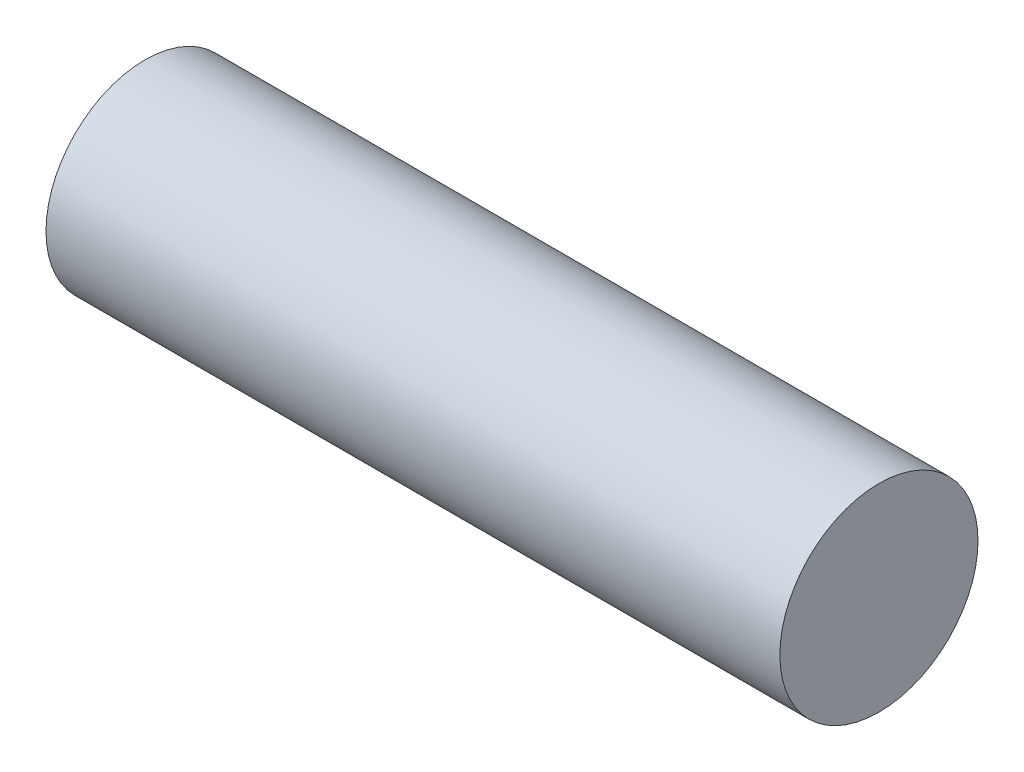
ISO-10303-21;
HEADER;
FILE_DESCRIPTION(('STEP AP214'),'2;1');
FILE_NAME('part.step','',(''),(''),'','','');
FILE_SCHEMA(('AUTOMOTIVE_DESIGN { 1 0 10303 214 1 1 1 1 }'));
ENDSEC;
DATA;
#1=APPLICATION_CONTEXT('core data for automotive mechanical design processes');
#2=APPLICATION_PROTOCOL_DEFINITION('international standard','automotive_design',2000,#1);
#3=PRODUCT_CONTEXT('',#1,'mechanical');
#4=PRODUCT('Part','Part','',(#3));
#5=PRODUCT_RELATED_PRODUCT_CATEGORY('part','',(#4));
#6=PRODUCT_DEFINITION_FORMATION('','',#4);
#7=PRODUCT_DEFINITION_CONTEXT('part definition',#1,'design');
#8=PRODUCT_DEFINITION('design','',#6,#7);
#9=PRODUCT_DEFINITION_SHAPE('','',#8);
#10=(LENGTH_UNIT() NAMED_UNIT(*) SI_UNIT(.MILLI.,.METRE.));
#11=(NAMED_UNIT(*) PLANE_ANGLE_UNIT() SI_UNIT($,.RADIAN.));
#12=(NAMED_UNIT(*) SI_UNIT($,.STERADIAN.) SOLID_ANGLE_UNIT());
#13=UNCERTAINTY_MEASURE_WITH_UNIT(LENGTH_MEASURE(1.E-05),#10,'distance_accuracy_value','');
#14=(GEOMETRIC_REPRESENTATION_CONTEXT(3) GLOBAL_UNCERTAINTY_ASSIGNED_CONTEXT((#13)) GLOBAL_UNIT_ASSIGNED_CONTEXT((#10,
#11,#12)) REPRESENTATION_CONTEXT('',''));
#15=CARTESIAN_POINT('',(0.,0.,0.));
#16=DIRECTION('',(0.,0.,1.));
#17=DIRECTION('',(1.,0.,0.));
#18=AXIS2_PLACEMENT_3D('',#15,#16,#17);
#19=CARTESIAN_POINT('',(44.45,0.,0.));
#20=DIRECTION('',(-1.,0.,0.));
#21=DIRECTION('',(0.,0.,1.));
#22=AXIS2_PLACEMENT_3D('',#19,#20,#21);
#23=CYLINDRICAL_SURFACE('',#22,6.);
#24=CARTESIAN_POINT('',(44.45,0.,0.));
#25=DIRECTION('',(1.,0.,0.));
#26=DIRECTION('',(0.,0.,-1.));
#27=AXIS2_PLACEMENT_3D('',#24,#25,#26);
#28=CIRCLE('',#27,6.);
#29=CARTESIAN_POINT('',(44.45,0.,-6.));
#30=VERTEX_POINT('',#29);
#31=EDGE_CURVE('E10',#30,#30,#28,.T.);
#32=ORIENTED_EDGE('',*,*,#31,.F.);
#33=EDGE_LOOP('',(#32));
#34=FACE_BOUND('',#33,.T.);
#35=CARTESIAN_POINT('',(0.,0.,0.));
#36=DIRECTION('',(1.,0.,0.));
#37=DIRECTION('',(0.,0.,-1.));
#38=AXIS2_PLACEMENT_3D('',#35,#36,#37);
#39=CIRCLE('',#38,6.);
#40=CARTESIAN_POINT('',(0.,0.,-6.));
#41=VERTEX_POINT('',#40);
#42=EDGE_CURVE('E34',#41,#41,#39,.T.);
#43=ORIENTED_EDGE('',*,*,#42,.T.);
#44=EDGE_LOOP('',(#43));
#45=FACE_BOUND('',#44,.T.);
#46=ADVANCED_FACE('F31',(#34,#45),#23,.T.);
#47=CARTESIAN_POINT('',(44.45,0.,0.));
#48=DIRECTION('',(1.,0.,0.));
#49=DIRECTION('',(0.,0.,-1.));
#50=AXIS2_PLACEMENT_3D('',#47,#48,#49);
#51=PLANE('',#50);
#52=ORIENTED_EDGE('',*,*,#31,.T.);
#53=EDGE_LOOP('',(#52));
#54=FACE_BOUND('',#53,.T.);
#55=ADVANCED_FACE('F46',(#54),#51,.T.);
#56=CARTESIAN_POINT('',(0.,0.,0.));
#57=DIRECTION('',(1.,0.,0.));
#58=DIRECTION('',(0.,0.,-1.));
#59=AXIS2_PLACEMENT_3D('',#56,#57,#58);
#60=PLANE('',#59);
#61=ORIENTED_EDGE('',*,*,#42,.F.);
#62=EDGE_LOOP('',(#61));
#63=FACE_BOUND('',#62,.T.);
#64=ADVANCED_FACE('F44',(#63),#60,.F.);
#65=CLOSED_SHELL('',(#46,#55,#64));
#66=MANIFOLD_SOLID_BREP('B2',#65);
#67=ADVANCED_BREP_SHAPE_REPRESENTATION('',(#18,#66),#14);
#68=SHAPE_DEFINITION_REPRESENTATION(#9,#67);
ENDSEC;
END-ISO-10303-21;
